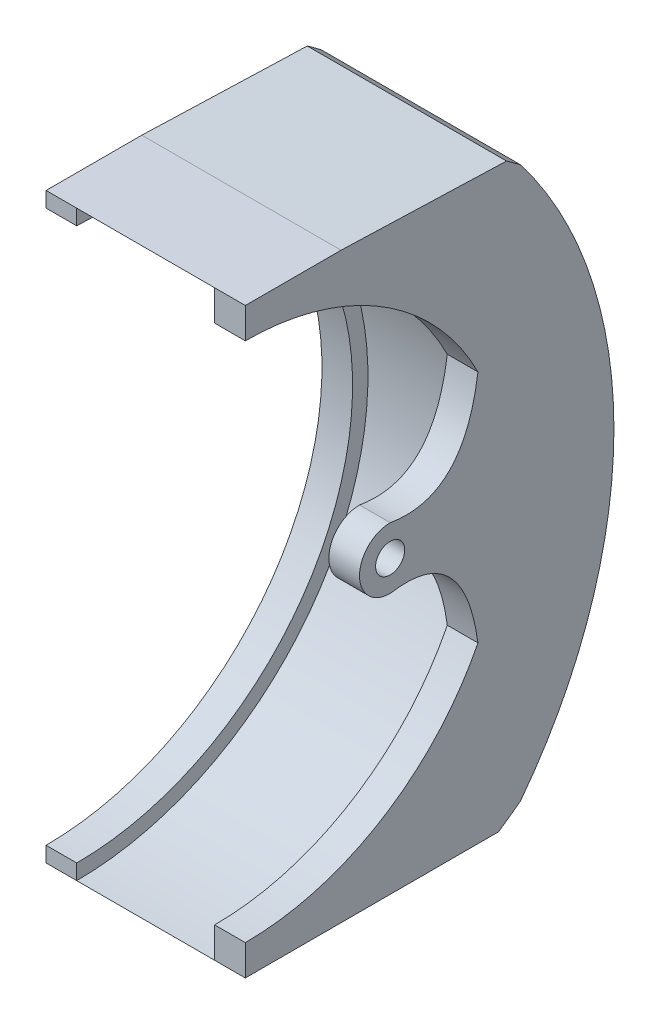
ISO-10303-21;
HEADER;
FILE_DESCRIPTION(('STEP AP214'),'2;1');
FILE_NAME('part.step','',(''),(''),'','','');
FILE_SCHEMA(('AUTOMOTIVE_DESIGN { 1 0 10303 214 1 1 1 1 }'));
ENDSEC;
DATA;
#1=APPLICATION_CONTEXT('core data for automotive mechanical design processes');
#2=APPLICATION_PROTOCOL_DEFINITION('international standard','automotive_design',2000,#1);
#3=PRODUCT_CONTEXT('',#1,'mechanical');
#4=PRODUCT('Part','Part','',(#3));
#5=PRODUCT_RELATED_PRODUCT_CATEGORY('part','',(#4));
#6=PRODUCT_DEFINITION_FORMATION('','',#4);
#7=PRODUCT_DEFINITION_CONTEXT('part definition',#1,'design');
#8=PRODUCT_DEFINITION('design','',#6,#7);
#9=PRODUCT_DEFINITION_SHAPE('','',#8);
#10=(LENGTH_UNIT() NAMED_UNIT(*) SI_UNIT(.MILLI.,.METRE.));
#11=(NAMED_UNIT(*) PLANE_ANGLE_UNIT() SI_UNIT($,.RADIAN.));
#12=(NAMED_UNIT(*) SI_UNIT($,.STERADIAN.) SOLID_ANGLE_UNIT());
#13=UNCERTAINTY_MEASURE_WITH_UNIT(LENGTH_MEASURE(1.E-05),#10,'distance_accuracy_value','');
#14=(GEOMETRIC_REPRESENTATION_CONTEXT(3) GLOBAL_UNCERTAINTY_ASSIGNED_CONTEXT((#13)) GLOBAL_UNIT_ASSIGNED_CONTEXT((#10,
#11,#12)) REPRESENTATION_CONTEXT('',''));
#15=CARTESIAN_POINT('',(0.,0.,0.));
#16=DIRECTION('',(0.,0.,1.));
#17=DIRECTION('',(1.,0.,0.));
#18=AXIS2_PLACEMENT_3D('',#15,#16,#17);
#19=CARTESIAN_POINT('',(53.6,0.,0.));
#20=DIRECTION('',(1.,0.,0.));
#21=DIRECTION('',(0.,0.,-1.));
#22=AXIS2_PLACEMENT_3D('',#19,#20,#21);
#23=CYLINDRICAL_SURFACE('',#22,17.);
#24=DIRECTION('',(1.,0.,0.));
#25=VECTOR('',#24,1.);
#26=CARTESIAN_POINT('',(35.554553330135,7.65564571925421,-15.1786392216583));
#27=LINE('',#26,#25);
#28=CARTESIAN_POINT('',(53.6,7.65564571925421,-15.1786392216583));
#29=VERTEX_POINT('',#28);
#30=CARTESIAN_POINT('',(55.6,7.65564571925421,-15.1786392216583));
#31=VERTEX_POINT('',#30);
#32=EDGE_CURVE('E164',#29,#31,#27,.T.);
#33=ORIENTED_EDGE('',*,*,#32,.T.);
#34=CARTESIAN_POINT('',(55.6,0.,0.));
#35=DIRECTION('',(-1.,0.,0.));
#36=DIRECTION('',(0.,0.,-1.));
#37=AXIS2_PLACEMENT_3D('',#34,#35,#36);
#38=CIRCLE('',#37,17.);
#39=CARTESIAN_POINT('',(55.6,17.,0.));
#40=VERTEX_POINT('',#39);
#41=EDGE_CURVE('E289',#40,#31,#38,.T.);
#42=ORIENTED_EDGE('',*,*,#41,.F.);
#43=DIRECTION('',(1.,0.,0.));
#44=VECTOR('',#43,1.);
#45=CARTESIAN_POINT('',(53.6,17.,0.));
#46=LINE('',#45,#44);
#47=CARTESIAN_POINT('',(53.6,17.,0.));
#48=VERTEX_POINT('',#47);
#49=EDGE_CURVE('E401',#48,#40,#46,.T.);
#50=ORIENTED_EDGE('',*,*,#49,.F.);
#51=CARTESIAN_POINT('',(53.6,0.,0.));
#52=DIRECTION('',(-1.,0.,0.));
#53=DIRECTION('',(0.,0.,-1.));
#54=AXIS2_PLACEMENT_3D('',#51,#52,#53);
#55=CIRCLE('',#54,17.);
#56=EDGE_CURVE('E48',#48,#29,#55,.T.);
#57=ORIENTED_EDGE('',*,*,#56,.T.);
#58=EDGE_LOOP('',(#33,#42,#50,#57));
#59=FACE_BOUND('',#58,.T.);
#60=ADVANCED_FACE('F33',(#59),#23,.F.);
#61=CARTESIAN_POINT('',(55.6,0.,2.18204462494887E-13));
#62=DIRECTION('',(-1.,0.,0.));
#63=DIRECTION('',(0.,0.,1.));
#64=AXIS2_PLACEMENT_3D('',#61,#62,#63);
#65=PLANE('',#64);
#66=CARTESIAN_POINT('',(55.6,5.5,0.));
#67=DIRECTION('',(-1.,0.,0.));
#68=DIRECTION('',(0.,0.,1.));
#69=AXIS2_PLACEMENT_3D('',#66,#67,#68);
#70=CIRCLE('',#69,29.55);
#71=CARTESIAN_POINT('',(55.6,-19.,-16.5212741639378));
#72=VERTEX_POINT('',#71);
#73=CARTESIAN_POINT('',(55.6,-17.9632505899002,-17.9632505899001));
#74=VERTEX_POINT('',#73);
#75=EDGE_CURVE('E333',#72,#74,#70,.F.);
#76=ORIENTED_EDGE('',*,*,#75,.T.);
#77=CARTESIAN_POINT('',(55.6,-1.57304724801577E-10,5.50000000019969));
#78=DIRECTION('',(1.,0.,0.));
#79=DIRECTION('',(0.,0.,1.));
#80=AXIS2_PLACEMENT_3D('',#77,#78,#79);
#81=CIRCLE('',#80,29.5500000002542);
#82=CARTESIAN_POINT('',(55.6,17.9632505899002,-17.9632505899002));
#83=VERTEX_POINT('',#82);
#84=EDGE_CURVE('E332',#74,#83,#81,.T.);
#85=ORIENTED_EDGE('',*,*,#84,.T.);
#86=CARTESIAN_POINT('',(55.6,-5.5,0.));
#87=DIRECTION('',(-1.,0.,0.));
#88=DIRECTION('',(0.,0.,1.));
#89=AXIS2_PLACEMENT_3D('',#86,#87,#88);
#90=CIRCLE('',#89,29.55);
#91=CARTESIAN_POINT('',(55.6,18.6404637545809,-17.0423152685826));
#92=VERTEX_POINT('',#91);
#93=EDGE_CURVE('E319',#83,#92,#90,.F.);
#94=ORIENTED_EDGE('',*,*,#93,.T.);
#95=DIRECTION('',(0.,0.0332802190535047,0.999446060085161));
#96=VECTOR('',#95,1.);
#97=CARTESIAN_POINT('',(55.6,19.,-6.24499799839833));
#98=LINE('',#97,#96);
#99=CARTESIAN_POINT('',(55.6,19.,-6.24499799839833));
#100=VERTEX_POINT('',#99);
#101=EDGE_CURVE('E340',#92,#100,#98,.T.);
#102=ORIENTED_EDGE('',*,*,#101,.T.);
#103=DIRECTION('',(0.,0.,1.));
#104=VECTOR('',#103,1.);
#105=CARTESIAN_POINT('',(55.6,19.,2.18204462494887E-13));
#106=LINE('',#105,#104);
#107=CARTESIAN_POINT('',(55.6,19.,0.));
#108=VERTEX_POINT('',#107);
#109=EDGE_CURVE('E359',#100,#108,#106,.T.);
#110=ORIENTED_EDGE('',*,*,#109,.T.);
#111=DIRECTION('',(0.,-1.,0.));
#112=VECTOR('',#111,1.);
#113=CARTESIAN_POINT('',(55.6,20.,0.));
#114=LINE('',#113,#112);
#115=EDGE_CURVE('E297',#108,#40,#114,.T.);
#116=ORIENTED_EDGE('',*,*,#115,.T.);
#117=ORIENTED_EDGE('',*,*,#41,.T.);
#118=CARTESIAN_POINT('',(55.6,7.65564571925421,-15.1786392216583));
#119=CARTESIAN_POINT('',(55.6,1.16511333181319,-14.2866520347722));
#120=CARTESIAN_POINT('',(55.6,2.,-9.45));
#121=B_SPLINE_CURVE_WITH_KNOTS('',2,(#118,#119,#120),.UNSPECIFIED.,.F.,.F.,(3,3),(0.,1.),.UNSPECIFIED.);
#122=CARTESIAN_POINT('',(55.6,2.,-9.45));
#123=VERTEX_POINT('',#122);
#124=EDGE_CURVE('E294',#31,#123,#121,.T.);
#125=ORIENTED_EDGE('',*,*,#124,.T.);
#126=CARTESIAN_POINT('',(55.6,0.,-9.45));
#127=DIRECTION('',(1.,0.,0.));
#128=DIRECTION('',(0.,0.,-1.));
#129=AXIS2_PLACEMENT_3D('',#126,#127,#128);
#130=CIRCLE('',#129,2.);
#131=CARTESIAN_POINT('',(55.6,-2.,-9.44999999999999));
#132=VERTEX_POINT('',#131);
#133=EDGE_CURVE('E301',#123,#132,#130,.T.);
#134=ORIENTED_EDGE('',*,*,#133,.T.);
#135=CARTESIAN_POINT('',(55.6,-2.,-9.45));
#136=CARTESIAN_POINT('',(55.6,-1.16511333181319,-14.2866520347722));
#137=CARTESIAN_POINT('',(55.6,-7.65564571925421,-15.1786392216583));
#138=B_SPLINE_CURVE_WITH_KNOTS('',2,(#135,#136,#137),.UNSPECIFIED.,.F.,.F.,(3,3),(0.,1.),.UNSPECIFIED.);
#139=CARTESIAN_POINT('',(55.6,-7.65564571925421,-15.1786392216583));
#140=VERTEX_POINT('',#139);
#141=EDGE_CURVE('E170',#132,#140,#138,.T.);
#142=ORIENTED_EDGE('',*,*,#141,.T.);
#143=CARTESIAN_POINT('',(55.6,-17.,0.));
#144=VERTEX_POINT('',#143);
#145=EDGE_CURVE('E56',#140,#144,#38,.T.);
#146=ORIENTED_EDGE('',*,*,#145,.T.);
#147=DIRECTION('',(0.,-1.,0.));
#148=VECTOR('',#147,1.);
#149=CARTESIAN_POINT('',(55.6,-20.,0.));
#150=LINE('',#149,#148);
#151=CARTESIAN_POINT('',(55.6,-19.,0.));
#152=VERTEX_POINT('',#151);
#153=EDGE_CURVE('E299',#144,#152,#150,.T.);
#154=ORIENTED_EDGE('',*,*,#153,.T.);
#155=DIRECTION('',(0.,0.,-1.));
#156=VECTOR('',#155,1.);
#157=CARTESIAN_POINT('',(55.6,-19.,2.18204462494887E-13));
#158=LINE('',#157,#156);
#159=EDGE_CURVE('E361',#152,#72,#158,.T.);
#160=ORIENTED_EDGE('',*,*,#159,.T.);
#161=EDGE_LOOP('',(#76,#85,#94,#102,#110,#116,#117,#125,#134,#142,#146,#154,#160));
#162=FACE_BOUND('',#161,.T.);
#163=CARTESIAN_POINT('',(55.6,0.,-9.45));
#164=DIRECTION('',(1.,0.,0.));
#165=DIRECTION('',(0.,0.,-1.));
#166=AXIS2_PLACEMENT_3D('',#163,#164,#165);
#167=CIRCLE('',#166,0.949999999999999);
#168=CARTESIAN_POINT('',(55.6,0.,-10.4));
#169=VERTEX_POINT('',#168);
#170=EDGE_CURVE('E174',#169,#169,#167,.T.);
#171=ORIENTED_EDGE('',*,*,#170,.F.);
#172=EDGE_LOOP('',(#171));
#173=FACE_BOUND('',#172,.T.);
#174=ADVANCED_FACE('F247',(#162,#173),#65,.F.);
#175=CARTESIAN_POINT('',(42.6,0.,0.));
#176=DIRECTION('',(-1.,0.,0.));
#177=DIRECTION('',(0.,0.,1.));
#178=AXIS2_PLACEMENT_3D('',#175,#176,#177);
#179=PLANE('',#178);
#180=CARTESIAN_POINT('',(42.6,-1.57304724801577E-10,5.50000000019969));
#181=DIRECTION('',(-1.,0.,0.));
#182=DIRECTION('',(0.,0.,1.));
#183=AXIS2_PLACEMENT_3D('',#180,#181,#182);
#184=CIRCLE('',#183,29.5500000002542);
#185=CARTESIAN_POINT('',(42.6,-17.9632505899002,-17.9632505899001));
#186=VERTEX_POINT('',#185);
#187=CARTESIAN_POINT('',(42.6,17.9632505899002,-17.9632505899002));
#188=VERTEX_POINT('',#187);
#189=EDGE_CURVE('E342',#186,#188,#184,.F.);
#190=ORIENTED_EDGE('',*,*,#189,.F.);
#191=CARTESIAN_POINT('',(42.6,5.5,0.));
#192=DIRECTION('',(-1.,0.,0.));
#193=DIRECTION('',(0.,0.,1.));
#194=AXIS2_PLACEMENT_3D('',#191,#192,#193);
#195=CIRCLE('',#194,29.55);
#196=CARTESIAN_POINT('',(42.6,-19.,-16.5212741639378));
#197=VERTEX_POINT('',#196);
#198=EDGE_CURVE('E336',#197,#186,#195,.F.);
#199=ORIENTED_EDGE('',*,*,#198,.F.);
#200=DIRECTION('',(0.,0.,-1.));
#201=VECTOR('',#200,1.);
#202=CARTESIAN_POINT('',(42.6,-19.,0.));
#203=LINE('',#202,#201);
#204=CARTESIAN_POINT('',(42.6,-19.,0.));
#205=VERTEX_POINT('',#204);
#206=EDGE_CURVE('E41',#205,#197,#203,.T.);
#207=ORIENTED_EDGE('',*,*,#206,.F.);
#208=DIRECTION('',(0.,1.,0.));
#209=VECTOR('',#208,1.);
#210=CARTESIAN_POINT('',(42.6,-20.,0.));
#211=LINE('',#210,#209);
#212=CARTESIAN_POINT('',(42.6,-18.,0.));
#213=VERTEX_POINT('',#212);
#214=EDGE_CURVE('E365',#205,#213,#211,.T.);
#215=ORIENTED_EDGE('',*,*,#214,.T.);
#216=CARTESIAN_POINT('',(42.6,0.,0.));
#217=DIRECTION('',(1.,0.,0.));
#218=DIRECTION('',(0.,0.,1.));
#219=AXIS2_PLACEMENT_3D('',#216,#217,#218);
#220=CIRCLE('',#219,18.);
#221=CARTESIAN_POINT('',(42.6,18.,0.));
#222=VERTEX_POINT('',#221);
#223=EDGE_CURVE('E367',#213,#222,#220,.T.);
#224=ORIENTED_EDGE('',*,*,#223,.T.);
#225=DIRECTION('',(0.,1.,0.));
#226=VECTOR('',#225,1.);
#227=CARTESIAN_POINT('',(42.6,20.,0.));
#228=LINE('',#227,#226);
#229=CARTESIAN_POINT('',(42.6,19.,0.));
#230=VERTEX_POINT('',#229);
#231=EDGE_CURVE('E370',#222,#230,#228,.T.);
#232=ORIENTED_EDGE('',*,*,#231,.T.);
#233=DIRECTION('',(0.,0.,1.));
#234=VECTOR('',#233,1.);
#235=CARTESIAN_POINT('',(42.6,19.,0.));
#236=LINE('',#235,#234);
#237=CARTESIAN_POINT('',(42.6,19.,-6.24499799839831));
#238=VERTEX_POINT('',#237);
#239=EDGE_CURVE('E407',#238,#230,#236,.T.);
#240=ORIENTED_EDGE('',*,*,#239,.F.);
#241=DIRECTION('',(0.,0.0332802190535047,0.999446060085161));
#242=VECTOR('',#241,1.);
#243=CARTESIAN_POINT('',(42.6,19.,-6.24499799839833));
#244=LINE('',#243,#242);
#245=CARTESIAN_POINT('',(42.6,18.6404637545809,-17.0423152685826));
#246=VERTEX_POINT('',#245);
#247=EDGE_CURVE('E345',#246,#238,#244,.T.);
#248=ORIENTED_EDGE('',*,*,#247,.F.);
#249=CARTESIAN_POINT('',(42.6,-5.5,0.));
#250=DIRECTION('',(-1.,0.,0.));
#251=DIRECTION('',(0.,0.,1.));
#252=AXIS2_PLACEMENT_3D('',#249,#250,#251);
#253=CIRCLE('',#252,29.55);
#254=EDGE_CURVE('E317',#188,#246,#253,.F.);
#255=ORIENTED_EDGE('',*,*,#254,.F.);
#256=EDGE_LOOP('',(#190,#199,#207,#215,#224,#232,#240,#248,#255));
#257=FACE_BOUND('',#256,.T.);
#258=ADVANCED_FACE('F243',(#257),#179,.T.);
#259=CARTESIAN_POINT('',(53.6,-20.,0.));
#260=DIRECTION('',(0.,0.,1.));
#261=DIRECTION('',(0.,-1.,0.));
#262=AXIS2_PLACEMENT_3D('',#259,#260,#261);
#263=PLANE('',#262);
#264=DIRECTION('',(1.,0.,0.));
#265=VECTOR('',#264,1.);
#266=CARTESIAN_POINT('',(0.,-19.,0.));
#267=LINE('',#266,#265);
#268=CARTESIAN_POINT('',(53.6,-19.,0.));
#269=VERTEX_POINT('',#268);
#270=EDGE_CURVE('E350',#269,#152,#267,.T.);
#271=ORIENTED_EDGE('',*,*,#270,.T.);
#272=ORIENTED_EDGE('',*,*,#153,.F.);
#273=DIRECTION('',(1.,0.,0.));
#274=VECTOR('',#273,1.);
#275=CARTESIAN_POINT('',(53.6,-17.,0.));
#276=LINE('',#275,#274);
#277=CARTESIAN_POINT('',(53.6,-17.,0.));
#278=VERTEX_POINT('',#277);
#279=EDGE_CURVE('E405',#278,#144,#276,.T.);
#280=ORIENTED_EDGE('',*,*,#279,.F.);
#281=DIRECTION('',(0.,-1.,0.));
#282=VECTOR('',#281,1.);
#283=CARTESIAN_POINT('',(53.6,-20.,0.));
#284=LINE('',#283,#282);
#285=EDGE_CURVE('E398',#278,#269,#284,.T.);
#286=ORIENTED_EDGE('',*,*,#285,.T.);
#287=EDGE_LOOP('',(#271,#272,#280,#286));
#288=FACE_BOUND('',#287,.T.);
#289=ADVANCED_FACE('F246',(#288),#263,.T.);
#290=CARTESIAN_POINT('',(53.6,20.,0.));
#291=DIRECTION('',(0.,0.,1.));
#292=DIRECTION('',(1.,0.,0.));
#293=AXIS2_PLACEMENT_3D('',#290,#291,#292);
#294=PLANE('',#293);
#295=DIRECTION('',(1.,0.,0.));
#296=VECTOR('',#295,1.);
#297=CARTESIAN_POINT('',(0.,19.,0.));
#298=LINE('',#297,#296);
#299=CARTESIAN_POINT('',(44.6,19.,0.));
#300=VERTEX_POINT('',#299);
#301=EDGE_CURVE('E354',#230,#300,#298,.T.);
#302=ORIENTED_EDGE('',*,*,#301,.F.);
#303=ORIENTED_EDGE('',*,*,#231,.F.);
#304=DIRECTION('',(1.,0.,0.));
#305=VECTOR('',#304,1.);
#306=CARTESIAN_POINT('',(42.6,18.,0.));
#307=LINE('',#306,#305);
#308=CARTESIAN_POINT('',(44.6,18.,0.));
#309=VERTEX_POINT('',#308);
#310=EDGE_CURVE('E373',#222,#309,#307,.T.);
#311=ORIENTED_EDGE('',*,*,#310,.T.);
#312=DIRECTION('',(0.,1.,0.));
#313=VECTOR('',#312,1.);
#314=CARTESIAN_POINT('',(44.6,20.,0.));
#315=LINE('',#314,#313);
#316=EDGE_CURVE('E368',#309,#300,#315,.T.);
#317=ORIENTED_EDGE('',*,*,#316,.T.);
#318=EDGE_LOOP('',(#302,#303,#311,#317));
#319=FACE_BOUND('',#318,.T.);
#320=ADVANCED_FACE('F263',(#319),#294,.T.);
#321=CARTESIAN_POINT('',(53.6,0.,2.18204462494887E-13));
#322=DIRECTION('',(-1.,0.,0.));
#323=DIRECTION('',(0.,0.,1.));
#324=AXIS2_PLACEMENT_3D('',#321,#322,#323);
#325=PLANE('',#324);
#326=DIRECTION('',(0.,-1.,0.));
#327=VECTOR('',#326,1.);
#328=CARTESIAN_POINT('',(53.6,20.,0.));
#329=LINE('',#328,#327);
#330=CARTESIAN_POINT('',(53.6,19.,0.));
#331=VERTEX_POINT('',#330);
#332=EDGE_CURVE('E395',#331,#48,#329,.T.);
#333=ORIENTED_EDGE('',*,*,#332,.F.);
#334=CARTESIAN_POINT('',(53.6,0.,0.));
#335=DIRECTION('',(1.,0.,0.));
#336=DIRECTION('',(0.,0.,1.));
#337=AXIS2_PLACEMENT_3D('',#334,#335,#336);
#338=CIRCLE('',#337,19.);
#339=EDGE_CURVE('E384',#269,#331,#338,.T.);
#340=ORIENTED_EDGE('',*,*,#339,.F.);
#341=ORIENTED_EDGE('',*,*,#285,.F.);
#342=CARTESIAN_POINT('',(53.6,-7.65564571925421,-15.1786392216583));
#343=VERTEX_POINT('',#342);
#344=EDGE_CURVE('E161',#343,#278,#55,.T.);
#345=ORIENTED_EDGE('',*,*,#344,.F.);
#346=CARTESIAN_POINT('',(53.6,-2.,-9.45));
#347=CARTESIAN_POINT('',(53.6,-1.16511333181319,-14.2866520347722));
#348=CARTESIAN_POINT('',(53.6,-7.65564571925421,-15.1786392216583));
#349=B_SPLINE_CURVE_WITH_KNOTS('',2,(#346,#347,#348),.UNSPECIFIED.,.F.,.F.,(3,3),(0.,1.),.UNSPECIFIED.);
#350=CARTESIAN_POINT('',(53.6,-2.,-9.44999999999999));
#351=VERTEX_POINT('',#350);
#352=EDGE_CURVE('E152',#351,#343,#349,.T.);
#353=ORIENTED_EDGE('',*,*,#352,.F.);
#354=CARTESIAN_POINT('',(53.6,0.,-9.45));
#355=DIRECTION('',(-1.,0.,0.));
#356=DIRECTION('',(0.,0.,1.));
#357=AXIS2_PLACEMENT_3D('',#354,#355,#356);
#358=CIRCLE('',#357,2.);
#359=CARTESIAN_POINT('',(53.6,2.,-9.45));
#360=VERTEX_POINT('',#359);
#361=EDGE_CURVE('E158',#360,#351,#358,.F.);
#362=ORIENTED_EDGE('',*,*,#361,.F.);
#363=CARTESIAN_POINT('',(53.6,7.65564571925421,-15.1786392216583));
#364=CARTESIAN_POINT('',(53.6,1.16511333181319,-14.2866520347722));
#365=CARTESIAN_POINT('',(53.6,2.,-9.45));
#366=B_SPLINE_CURVE_WITH_KNOTS('',2,(#363,#364,#365),.UNSPECIFIED.,.F.,.F.,(3,3),(0.,1.),.UNSPECIFIED.);
#367=EDGE_CURVE('E185',#29,#360,#366,.T.);
#368=ORIENTED_EDGE('',*,*,#367,.F.);
#369=ORIENTED_EDGE('',*,*,#56,.F.);
#370=EDGE_LOOP('',(#333,#340,#341,#345,#353,#362,#368,#369));
#371=FACE_BOUND('',#370,.T.);
#372=CARTESIAN_POINT('',(53.6,0.,-9.45));
#373=DIRECTION('',(-1.,0.,0.));
#374=DIRECTION('',(0.,0.,1.));
#375=AXIS2_PLACEMENT_3D('',#372,#373,#374);
#376=CIRCLE('',#375,0.949999999999999);
#377=CARTESIAN_POINT('',(53.6,0.,-8.5));
#378=VERTEX_POINT('',#377);
#379=EDGE_CURVE('E183',#378,#378,#376,.F.);
#380=ORIENTED_EDGE('',*,*,#379,.T.);
#381=EDGE_LOOP('',(#380));
#382=FACE_BOUND('',#381,.T.);
#383=ADVANCED_FACE('F155',(#371,#382),#325,.T.);
#384=CARTESIAN_POINT('',(114.,0.,5.5));
#385=DIRECTION('',(-1.,0.,0.));
#386=DIRECTION('',(0.,0.,1.));
#387=AXIS2_PLACEMENT_3D('',#384,#385,#386);
#388=CYLINDRICAL_SURFACE('',#387,29.55);
#389=DIRECTION('',(1.,0.,0.));
#390=VECTOR('',#389,1.);
#391=CARTESIAN_POINT('',(44.35,-17.9632505899002,-17.9632505899002));
#392=LINE('',#391,#390);
#393=EDGE_CURVE('E329',#74,#186,#392,.F.);
#394=ORIENTED_EDGE('',*,*,#393,.T.);
#395=ORIENTED_EDGE('',*,*,#189,.T.);
#396=DIRECTION('',(1.,0.,0.));
#397=VECTOR('',#396,1.);
#398=CARTESIAN_POINT('',(44.35,17.9632505899002,-17.9632505899002));
#399=LINE('',#398,#397);
#400=EDGE_CURVE('E323',#188,#83,#399,.T.);
#401=ORIENTED_EDGE('',*,*,#400,.T.);
#402=ORIENTED_EDGE('',*,*,#84,.F.);
#403=EDGE_LOOP('',(#394,#395,#401,#402));
#404=FACE_BOUND('',#403,.T.);
#405=ADVANCED_FACE('F35',(#404),#388,.T.);
#406=CARTESIAN_POINT('',(44.6,-19.,0.));
#407=VERTEX_POINT('',#406);
#408=EDGE_CURVE('E353',#205,#407,#267,.T.);
#409=ORIENTED_EDGE('',*,*,#408,.T.);
#410=DIRECTION('',(0.,1.,0.));
#411=VECTOR('',#410,1.);
#412=CARTESIAN_POINT('',(44.6,-20.,0.));
#413=LINE('',#412,#411);
#414=CARTESIAN_POINT('',(44.6,-18.,0.));
#415=VERTEX_POINT('',#414);
#416=EDGE_CURVE('E364',#407,#415,#413,.T.);
#417=ORIENTED_EDGE('',*,*,#416,.T.);
#418=DIRECTION('',(1.,0.,0.));
#419=VECTOR('',#418,1.);
#420=CARTESIAN_POINT('',(42.6,-18.,0.));
#421=LINE('',#420,#419);
#422=EDGE_CURVE('E381',#213,#415,#421,.T.);
#423=ORIENTED_EDGE('',*,*,#422,.F.);
#424=ORIENTED_EDGE('',*,*,#214,.F.);
#425=EDGE_LOOP('',(#409,#417,#423,#424));
#426=FACE_BOUND('',#425,.T.);
#427=ADVANCED_FACE('F267',(#426),#263,.T.);
#428=DIRECTION('',(1.,0.,0.));
#429=VECTOR('',#428,1.);
#430=CARTESIAN_POINT('',(35.554553330135,-7.65564571925421,-15.1786392216583));
#431=LINE('',#430,#429);
#432=EDGE_CURVE('E163',#343,#140,#431,.T.);
#433=ORIENTED_EDGE('',*,*,#432,.F.);
#434=ORIENTED_EDGE('',*,*,#344,.T.);
#435=ORIENTED_EDGE('',*,*,#279,.T.);
#436=ORIENTED_EDGE('',*,*,#145,.F.);
#437=EDGE_LOOP('',(#433,#434,#435,#436));
#438=FACE_BOUND('',#437,.T.);
#439=ADVANCED_FACE('F270',(#438),#23,.F.);
#440=EDGE_CURVE('E347',#331,#108,#298,.T.);
#441=ORIENTED_EDGE('',*,*,#440,.F.);
#442=ORIENTED_EDGE('',*,*,#332,.T.);
#443=ORIENTED_EDGE('',*,*,#49,.T.);
#444=ORIENTED_EDGE('',*,*,#115,.F.);
#445=EDGE_LOOP('',(#441,#442,#443,#444));
#446=FACE_BOUND('',#445,.T.);
#447=ADVANCED_FACE('F259',(#446),#294,.T.);
#448=CARTESIAN_POINT('',(44.6,0.,0.));
#449=DIRECTION('',(1.,0.,0.));
#450=DIRECTION('',(0.,0.,-1.));
#451=AXIS2_PLACEMENT_3D('',#448,#449,#450);
#452=CYLINDRICAL_SURFACE('',#451,19.);
#453=ORIENTED_EDGE('',*,*,#339,.T.);
#454=DIRECTION('',(1.,0.,0.));
#455=VECTOR('',#454,1.);
#456=CARTESIAN_POINT('',(44.6,19.,0.));
#457=LINE('',#456,#455);
#458=EDGE_CURVE('E388',#300,#331,#457,.T.);
#459=ORIENTED_EDGE('',*,*,#458,.F.);
#460=CARTESIAN_POINT('',(44.6,0.,0.));
#461=DIRECTION('',(1.,0.,0.));
#462=DIRECTION('',(0.,0.,1.));
#463=AXIS2_PLACEMENT_3D('',#460,#461,#462);
#464=CIRCLE('',#463,19.);
#465=EDGE_CURVE('E385',#407,#300,#464,.T.);
#466=ORIENTED_EDGE('',*,*,#465,.F.);
#467=DIRECTION('',(1.,0.,0.));
#468=VECTOR('',#467,1.);
#469=CARTESIAN_POINT('',(44.6,-19.,0.));
#470=LINE('',#469,#468);
#471=EDGE_CURVE('E392',#407,#269,#470,.T.);
#472=ORIENTED_EDGE('',*,*,#471,.T.);
#473=EDGE_LOOP('',(#453,#459,#466,#472));
#474=FACE_BOUND('',#473,.T.);
#475=ADVANCED_FACE('F252',(#474),#452,.F.);
#476=CARTESIAN_POINT('',(44.6,0.,0.));
#477=DIRECTION('',(-1.,0.,0.));
#478=DIRECTION('',(0.,0.,1.));
#479=AXIS2_PLACEMENT_3D('',#476,#477,#478);
#480=PLANE('',#479);
#481=ORIENTED_EDGE('',*,*,#416,.F.);
#482=ORIENTED_EDGE('',*,*,#465,.T.);
#483=ORIENTED_EDGE('',*,*,#316,.F.);
#484=CARTESIAN_POINT('',(44.6,0.,0.));
#485=DIRECTION('',(1.,0.,0.));
#486=DIRECTION('',(0.,0.,1.));
#487=AXIS2_PLACEMENT_3D('',#484,#485,#486);
#488=CIRCLE('',#487,18.);
#489=EDGE_CURVE('E375',#415,#309,#488,.T.);
#490=ORIENTED_EDGE('',*,*,#489,.F.);
#491=EDGE_LOOP('',(#481,#482,#483,#490));
#492=FACE_BOUND('',#491,.T.);
#493=ADVANCED_FACE('F249',(#492),#480,.F.);
#494=CARTESIAN_POINT('',(42.6,0.,0.));
#495=DIRECTION('',(1.,0.,0.));
#496=DIRECTION('',(0.,0.,-1.));
#497=AXIS2_PLACEMENT_3D('',#494,#495,#496);
#498=CYLINDRICAL_SURFACE('',#497,18.);
#499=ORIENTED_EDGE('',*,*,#489,.T.);
#500=ORIENTED_EDGE('',*,*,#310,.F.);
#501=ORIENTED_EDGE('',*,*,#223,.F.);
#502=ORIENTED_EDGE('',*,*,#422,.T.);
#503=EDGE_LOOP('',(#499,#500,#501,#502));
#504=FACE_BOUND('',#503,.T.);
#505=ADVANCED_FACE('F241',(#504),#498,.F.);
#506=CARTESIAN_POINT('',(0.,19.,0.));
#507=DIRECTION('',(0.,-1.,0.));
#508=DIRECTION('',(0.,0.,-1.));
#509=AXIS2_PLACEMENT_3D('',#506,#507,#508);
#510=PLANE('',#509);
#511=DIRECTION('',(1.,0.,0.));
#512=VECTOR('',#511,1.);
#513=CARTESIAN_POINT('',(53.6,19.,-6.24499799839816));
#514=LINE('',#513,#512);
#515=EDGE_CURVE('E356',#100,#238,#514,.F.);
#516=ORIENTED_EDGE('',*,*,#515,.T.);
#517=ORIENTED_EDGE('',*,*,#239,.T.);
#518=ORIENTED_EDGE('',*,*,#301,.T.);
#519=ORIENTED_EDGE('',*,*,#458,.T.);
#520=ORIENTED_EDGE('',*,*,#440,.T.);
#521=ORIENTED_EDGE('',*,*,#109,.F.);
#522=EDGE_LOOP('',(#516,#517,#518,#519,#520,#521));
#523=FACE_BOUND('',#522,.T.);
#524=ADVANCED_FACE('F237',(#523),#510,.F.);
#525=CARTESIAN_POINT('',(0.,-19.,0.));
#526=DIRECTION('',(0.,1.,0.));
#527=DIRECTION('',(0.,0.,1.));
#528=AXIS2_PLACEMENT_3D('',#525,#526,#527);
#529=PLANE('',#528);
#530=ORIENTED_EDGE('',*,*,#206,.T.);
#531=DIRECTION('',(1.,0.,0.));
#532=VECTOR('',#531,1.);
#533=CARTESIAN_POINT('',(0.,-19.,-16.5212741639378));
#534=LINE('',#533,#532);
#535=EDGE_CURVE('E328',#197,#72,#534,.T.);
#536=ORIENTED_EDGE('',*,*,#535,.T.);
#537=ORIENTED_EDGE('',*,*,#159,.F.);
#538=ORIENTED_EDGE('',*,*,#270,.F.);
#539=ORIENTED_EDGE('',*,*,#471,.F.);
#540=ORIENTED_EDGE('',*,*,#408,.F.);
#541=EDGE_LOOP('',(#530,#536,#537,#538,#539,#540));
#542=FACE_BOUND('',#541,.T.);
#543=ADVANCED_FACE('F233',(#542),#529,.F.);
#544=CARTESIAN_POINT('',(29.9027536132821,19.,-6.24499799839833));
#545=DIRECTION('',(0.,0.999446060085161,-0.0332802190535047));
#546=DIRECTION('',(0.,0.0332802190535047,0.999446060085161));
#547=AXIS2_PLACEMENT_3D('',#544,#545,#546);
#548=PLANE('',#547);
#549=DIRECTION('',(1.,0.,0.));
#550=VECTOR('',#549,1.);
#551=CARTESIAN_POINT('',(0.,18.6404637545809,-17.0423152685826));
#552=LINE('',#551,#550);
#553=EDGE_CURVE('E11',#246,#92,#552,.T.);
#554=ORIENTED_EDGE('',*,*,#553,.F.);
#555=ORIENTED_EDGE('',*,*,#247,.T.);
#556=ORIENTED_EDGE('',*,*,#515,.F.);
#557=ORIENTED_EDGE('',*,*,#101,.F.);
#558=EDGE_LOOP('',(#554,#555,#556,#557));
#559=FACE_BOUND('',#558,.T.);
#560=ADVANCED_FACE('F226',(#559),#548,.T.);
#561=CARTESIAN_POINT('',(0.,-5.5,0.));
#562=DIRECTION('',(1.,0.,0.));
#563=DIRECTION('',(0.,0.,-1.));
#564=AXIS2_PLACEMENT_3D('',#561,#562,#563);
#565=CYLINDRICAL_SURFACE('',#564,29.55);
#566=ORIENTED_EDGE('',*,*,#254,.T.);
#567=ORIENTED_EDGE('',*,*,#553,.T.);
#568=ORIENTED_EDGE('',*,*,#93,.F.);
#569=ORIENTED_EDGE('',*,*,#400,.F.);
#570=EDGE_LOOP('',(#566,#567,#568,#569));
#571=FACE_BOUND('',#570,.T.);
#572=ADVANCED_FACE('F223',(#571),#565,.T.);
#573=CARTESIAN_POINT('',(0.,5.5,0.));
#574=DIRECTION('',(1.,0.,0.));
#575=DIRECTION('',(0.,0.,-1.));
#576=AXIS2_PLACEMENT_3D('',#573,#574,#575);
#577=CYLINDRICAL_SURFACE('',#576,29.55);
#578=ORIENTED_EDGE('',*,*,#75,.F.);
#579=ORIENTED_EDGE('',*,*,#535,.F.);
#580=ORIENTED_EDGE('',*,*,#198,.T.);
#581=ORIENTED_EDGE('',*,*,#393,.F.);
#582=EDGE_LOOP('',(#578,#579,#580,#581));
#583=FACE_BOUND('',#582,.T.);
#584=ADVANCED_FACE('F217',(#583),#577,.T.);
#585=CARTESIAN_POINT('',(35.554553330135,7.65564571925421,-15.1786392216583));
#586=CARTESIAN_POINT('',(35.554553330135,1.16511333181319,-14.2866520347722));
#587=CARTESIAN_POINT('',(35.554553330135,2.,-9.45));
#588=B_SPLINE_CURVE_WITH_KNOTS('',2,(#585,#586,#587),.UNSPECIFIED.,.F.,.F.,(3,3),(0.,1.),.UNSPECIFIED.);
#589=DIRECTION('',(1.,0.,0.));
#590=VECTOR('',#589,1.);
#591=SURFACE_OF_LINEAR_EXTRUSION('',#588,#590);
#592=ORIENTED_EDGE('',*,*,#32,.F.);
#593=ORIENTED_EDGE('',*,*,#367,.T.);
#594=DIRECTION('',(1.,0.,0.));
#595=VECTOR('',#594,1.);
#596=CARTESIAN_POINT('',(35.554553330135,2.,-9.45));
#597=LINE('',#596,#595);
#598=EDGE_CURVE('E178',#360,#123,#597,.T.);
#599=ORIENTED_EDGE('',*,*,#598,.T.);
#600=ORIENTED_EDGE('',*,*,#124,.F.);
#601=EDGE_LOOP('',(#592,#593,#599,#600));
#602=FACE_BOUND('',#601,.T.);
#603=ADVANCED_FACE('F214',(#602),#591,.T.);
#604=CARTESIAN_POINT('',(35.554553330135,-2.,-9.45));
#605=CARTESIAN_POINT('',(35.554553330135,-1.16511333181319,-14.2866520347722));
#606=CARTESIAN_POINT('',(35.554553330135,-7.65564571925421,-15.1786392216583));
#607=B_SPLINE_CURVE_WITH_KNOTS('',2,(#604,#605,#606),.UNSPECIFIED.,.F.,.F.,(3,3),(0.,1.),.UNSPECIFIED.);
#608=DIRECTION('',(1.,0.,0.));
#609=VECTOR('',#608,1.);
#610=SURFACE_OF_LINEAR_EXTRUSION('',#607,#609);
#611=DIRECTION('',(1.,0.,0.));
#612=VECTOR('',#611,1.);
#613=CARTESIAN_POINT('',(35.554553330135,-2.,-9.44999999999999));
#614=LINE('',#613,#612);
#615=EDGE_CURVE('E167',#351,#132,#614,.T.);
#616=ORIENTED_EDGE('',*,*,#615,.F.);
#617=ORIENTED_EDGE('',*,*,#352,.T.);
#618=ORIENTED_EDGE('',*,*,#432,.T.);
#619=ORIENTED_EDGE('',*,*,#141,.F.);
#620=EDGE_LOOP('',(#616,#617,#618,#619));
#621=FACE_BOUND('',#620,.T.);
#622=ADVANCED_FACE('F168',(#621),#610,.T.);
#623=CARTESIAN_POINT('',(35.554553330135,0.,-9.45));
#624=DIRECTION('',(1.,0.,0.));
#625=DIRECTION('',(0.,0.,-1.));
#626=AXIS2_PLACEMENT_3D('',#623,#624,#625);
#627=CYLINDRICAL_SURFACE('',#626,2.);
#628=ORIENTED_EDGE('',*,*,#598,.F.);
#629=ORIENTED_EDGE('',*,*,#361,.T.);
#630=ORIENTED_EDGE('',*,*,#615,.T.);
#631=ORIENTED_EDGE('',*,*,#133,.F.);
#632=EDGE_LOOP('',(#628,#629,#630,#631));
#633=FACE_BOUND('',#632,.T.);
#634=ADVANCED_FACE('F177',(#633),#627,.T.);
#635=CARTESIAN_POINT('',(35.554553330135,0.,-9.45));
#636=DIRECTION('',(1.,0.,0.));
#637=DIRECTION('',(0.,0.,-1.));
#638=AXIS2_PLACEMENT_3D('',#635,#636,#637);
#639=CYLINDRICAL_SURFACE('',#638,0.949999999999999);
#640=ORIENTED_EDGE('',*,*,#170,.T.);
#641=EDGE_LOOP('',(#640));
#642=FACE_BOUND('',#641,.T.);
#643=ORIENTED_EDGE('',*,*,#379,.F.);
#644=EDGE_LOOP('',(#643));
#645=FACE_BOUND('',#644,.T.);
#646=ADVANCED_FACE('F219',(#642,#645),#639,.F.);
#647=CLOSED_SHELL('',(#60,#174,#258,#289,#320,#383,#405,#427,#439,#447,#475,#493,#505,#524,#543,
#560,#572,#584,#603,#622,#634,#646));
#648=MANIFOLD_SOLID_BREP('B2',#647);
#649=ADVANCED_BREP_SHAPE_REPRESENTATION('',(#18,#648),#14);
#650=SHAPE_DEFINITION_REPRESENTATION(#9,#649);
ENDSEC;
END-ISO-10303-21;
